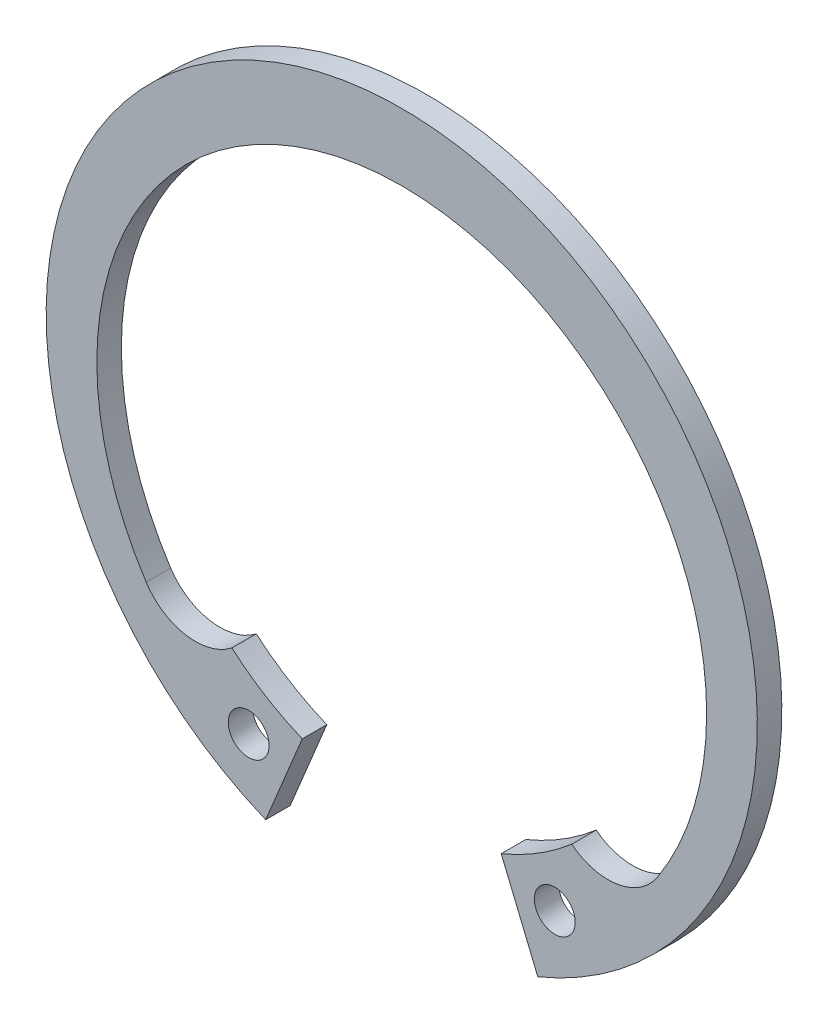
ISO-10303-21;
HEADER;
FILE_DESCRIPTION(('STEP AP214'),'2;1');
FILE_NAME('part.step','',(''),(''),'','','');
FILE_SCHEMA(('AUTOMOTIVE_DESIGN { 1 0 10303 214 1 1 1 1 }'));
ENDSEC;
DATA;
#1=APPLICATION_CONTEXT('core data for automotive mechanical design processes');
#2=APPLICATION_PROTOCOL_DEFINITION('international standard','automotive_design',2000,#1);
#3=PRODUCT_CONTEXT('',#1,'mechanical');
#4=PRODUCT('Part','Part','',(#3));
#5=PRODUCT_RELATED_PRODUCT_CATEGORY('part','',(#4));
#6=PRODUCT_DEFINITION_FORMATION('','',#4);
#7=PRODUCT_DEFINITION_CONTEXT('part definition',#1,'design');
#8=PRODUCT_DEFINITION('design','',#6,#7);
#9=PRODUCT_DEFINITION_SHAPE('','',#8);
#10=(LENGTH_UNIT() NAMED_UNIT(*) SI_UNIT(.MILLI.,.METRE.));
#11=(NAMED_UNIT(*) PLANE_ANGLE_UNIT() SI_UNIT($,.RADIAN.));
#12=(NAMED_UNIT(*) SI_UNIT($,.STERADIAN.) SOLID_ANGLE_UNIT());
#13=UNCERTAINTY_MEASURE_WITH_UNIT(LENGTH_MEASURE(1.E-05),#10,'distance_accuracy_value','');
#14=(GEOMETRIC_REPRESENTATION_CONTEXT(3) GLOBAL_UNCERTAINTY_ASSIGNED_CONTEXT((#13)) GLOBAL_UNIT_ASSIGNED_CONTEXT((#10,
#11,#12)) REPRESENTATION_CONTEXT('',''));
#15=CARTESIAN_POINT('',(0.,0.,0.));
#16=DIRECTION('',(0.,0.,1.));
#17=DIRECTION('',(1.,0.,0.));
#18=AXIS2_PLACEMENT_3D('',#15,#16,#17);
#19=CARTESIAN_POINT('',(0.,0.,-1.5));
#20=DIRECTION('',(0.,0.,1.));
#21=DIRECTION('',(1.,0.,0.));
#22=AXIS2_PLACEMENT_3D('',#19,#20,#21);
#23=CYLINDRICAL_SURFACE('',#22,21.75);
#24=CARTESIAN_POINT('',(0.,0.,0.));
#25=DIRECTION('',(0.,0.,1.));
#26=DIRECTION('',(1.,0.,0.));
#27=AXIS2_PLACEMENT_3D('',#24,#25,#26);
#28=CIRCLE('',#27,21.75);
#29=CARTESIAN_POINT('',(8.32336465394073,-20.0943798321205,0.));
#30=VERTEX_POINT('',#29);
#31=CARTESIAN_POINT('',(-8.32336465394072,-20.0943798321205,0.));
#32=VERTEX_POINT('',#31);
#33=EDGE_CURVE('E130',#30,#32,#28,.T.);
#34=ORIENTED_EDGE('',*,*,#33,.F.);
#35=DIRECTION('',(0.,0.,1.));
#36=VECTOR('',#35,1.);
#37=CARTESIAN_POINT('',(8.32336465394073,-20.0943798321205,-1.5));
#38=LINE('',#37,#36);
#39=CARTESIAN_POINT('',(8.32336465394073,-20.0943798321205,-1.5));
#40=VERTEX_POINT('',#39);
#41=EDGE_CURVE('E11',#40,#30,#38,.T.);
#42=ORIENTED_EDGE('',*,*,#41,.F.);
#43=CARTESIAN_POINT('',(0.,0.,-1.5));
#44=DIRECTION('',(0.,0.,1.));
#45=DIRECTION('',(1.,0.,0.));
#46=AXIS2_PLACEMENT_3D('',#43,#44,#45);
#47=CIRCLE('',#46,21.75);
#48=CARTESIAN_POINT('',(-8.32336465394072,-20.0943798321205,-1.5));
#49=VERTEX_POINT('',#48);
#50=EDGE_CURVE('E151',#40,#49,#47,.T.);
#51=ORIENTED_EDGE('',*,*,#50,.T.);
#52=DIRECTION('',(0.,0.,1.));
#53=VECTOR('',#52,1.);
#54=CARTESIAN_POINT('',(-8.32336465394072,-20.0943798321205,-1.5));
#55=LINE('',#54,#53);
#56=EDGE_CURVE('E36',#49,#32,#55,.T.);
#57=ORIENTED_EDGE('',*,*,#56,.T.);
#58=EDGE_LOOP('',(#34,#42,#51,#57));
#59=FACE_BOUND('',#58,.T.);
#60=ADVANCED_FACE('F33',(#59),#23,.T.);
#61=CARTESIAN_POINT('',(6.08466657460495,-14.6896845669294,-1.5));
#62=DIRECTION('',(-0.923879532511287,-0.382683432365091,0.));
#63=DIRECTION('',(0.382683432365091,-0.923879532511287,0.));
#64=AXIS2_PLACEMENT_3D('',#61,#62,#63);
#65=PLANE('',#64);
#66=DIRECTION('',(0.382683432365091,-0.923879532511286,0.));
#67=VECTOR('',#66,1.);
#68=CARTESIAN_POINT('',(6.08466657460495,-14.6896845669294,0.));
#69=LINE('',#68,#67);
#70=CARTESIAN_POINT('',(6.08466657460495,-14.6896845669294,0.));
#71=VERTEX_POINT('',#70);
#72=EDGE_CURVE('E149',#71,#30,#69,.T.);
#73=ORIENTED_EDGE('',*,*,#72,.F.);
#74=DIRECTION('',(0.,0.,1.));
#75=VECTOR('',#74,1.);
#76=CARTESIAN_POINT('',(6.08466657460495,-14.6896845669294,-1.5));
#77=LINE('',#76,#75);
#78=CARTESIAN_POINT('',(6.08466657460495,-14.6896845669294,-1.5));
#79=VERTEX_POINT('',#78);
#80=EDGE_CURVE('E42',#79,#71,#77,.T.);
#81=ORIENTED_EDGE('',*,*,#80,.F.);
#82=DIRECTION('',(0.382683432365091,-0.923879532511286,0.));
#83=VECTOR('',#82,1.);
#84=CARTESIAN_POINT('',(6.08466657460495,-14.6896845669294,-1.5));
#85=LINE('',#84,#83);
#86=EDGE_CURVE('E120',#79,#40,#85,.T.);
#87=ORIENTED_EDGE('',*,*,#86,.T.);
#88=ORIENTED_EDGE('',*,*,#41,.T.);
#89=EDGE_LOOP('',(#73,#81,#87,#88));
#90=FACE_BOUND('',#89,.T.);
#91=ADVANCED_FACE('F163',(#90),#65,.T.);
#92=CARTESIAN_POINT('',(0.,0.,-1.5));
#93=DIRECTION('',(0.,0.,1.));
#94=DIRECTION('',(1.,0.,0.));
#95=AXIS2_PLACEMENT_3D('',#92,#93,#94);
#96=CYLINDRICAL_SURFACE('',#95,15.9);
#97=CARTESIAN_POINT('',(0.,0.,0.));
#98=DIRECTION('',(0.,0.,-1.));
#99=DIRECTION('',(-1.,0.,0.));
#100=AXIS2_PLACEMENT_3D('',#97,#98,#99);
#101=CIRCLE('',#100,15.9);
#102=CARTESIAN_POINT('',(10.3953826079096,-12.0310440293089,0.));
#103=VERTEX_POINT('',#102);
#104=EDGE_CURVE('E107',#103,#71,#101,.T.);
#105=ORIENTED_EDGE('',*,*,#104,.F.);
#106=DIRECTION('',(0.,0.,1.));
#107=VECTOR('',#106,1.);
#108=CARTESIAN_POINT('',(10.3953826079096,-12.0310440293089,-1.5));
#109=LINE('',#108,#107);
#110=CARTESIAN_POINT('',(10.3953826079096,-12.0310440293089,-1.5));
#111=VERTEX_POINT('',#110);
#112=EDGE_CURVE('E102',#111,#103,#109,.T.);
#113=ORIENTED_EDGE('',*,*,#112,.F.);
#114=CARTESIAN_POINT('',(0.,0.,-1.5));
#115=DIRECTION('',(0.,0.,-1.));
#116=DIRECTION('',(-1.,0.,0.));
#117=AXIS2_PLACEMENT_3D('',#114,#115,#116);
#118=CIRCLE('',#117,15.9);
#119=EDGE_CURVE('E105',#111,#79,#118,.T.);
#120=ORIENTED_EDGE('',*,*,#119,.T.);
#121=ORIENTED_EDGE('',*,*,#80,.T.);
#122=EDGE_LOOP('',(#105,#113,#120,#121));
#123=FACE_BOUND('',#122,.T.);
#124=ADVANCED_FACE('F104',(#123),#96,.F.);
#125=CARTESIAN_POINT('',(12.619666560528,-9.20039730141722,-1.5));
#126=DIRECTION('',(0.,0.,1.));
#127=DIRECTION('',(1.,0.,0.));
#128=AXIS2_PLACEMENT_3D('',#125,#126,#127);
#129=CYLINDRICAL_SURFACE('',#128,3.6);
#130=CARTESIAN_POINT('',(12.619666560528,-9.20039730141722,0.));
#131=DIRECTION('',(0.,0.,-1.));
#132=DIRECTION('',(-1.,0.,0.));
#133=AXIS2_PLACEMENT_3D('',#130,#131,#132);
#134=CIRCLE('',#133,3.6);
#135=CARTESIAN_POINT('',(15.6383243424483,-11.1619541309921,0.));
#136=VERTEX_POINT('',#135);
#137=EDGE_CURVE('E146',#136,#103,#134,.T.);
#138=ORIENTED_EDGE('',*,*,#137,.F.);
#139=DIRECTION('',(0.,0.,1.));
#140=VECTOR('',#139,1.);
#141=CARTESIAN_POINT('',(15.6383243424483,-11.1619541309921,-1.5));
#142=LINE('',#141,#140);
#143=CARTESIAN_POINT('',(15.6383243424483,-11.1619541309921,-1.5));
#144=VERTEX_POINT('',#143);
#145=EDGE_CURVE('E112',#144,#136,#142,.T.);
#146=ORIENTED_EDGE('',*,*,#145,.F.);
#147=CARTESIAN_POINT('',(12.619666560528,-9.20039730141722,-1.5));
#148=DIRECTION('',(0.,0.,-1.));
#149=DIRECTION('',(-1.,0.,0.));
#150=AXIS2_PLACEMENT_3D('',#147,#148,#149);
#151=CIRCLE('',#150,3.6);
#152=EDGE_CURVE('E118',#144,#111,#151,.T.);
#153=ORIENTED_EDGE('',*,*,#152,.T.);
#154=ORIENTED_EDGE('',*,*,#112,.T.);
#155=EDGE_LOOP('',(#138,#146,#153,#154));
#156=FACE_BOUND('',#155,.T.);
#157=ADVANCED_FACE('F122',(#156),#129,.F.);
#158=CARTESIAN_POINT('',(0.,-1.,-1.5));
#159=DIRECTION('',(0.,0.,1.));
#160=DIRECTION('',(1.,0.,0.));
#161=AXIS2_PLACEMENT_3D('',#158,#159,#160);
#162=CYLINDRICAL_SURFACE('',#161,18.65);
#163=CARTESIAN_POINT('',(0.,-1.,0.));
#164=DIRECTION('',(0.,0.,-1.));
#165=DIRECTION('',(1.,0.,0.));
#166=AXIS2_PLACEMENT_3D('',#163,#164,#165);
#167=CIRCLE('',#166,18.65);
#168=CARTESIAN_POINT('',(-15.6383243424483,-11.1619541309921,0.));
#169=VERTEX_POINT('',#168);
#170=EDGE_CURVE('E143',#169,#136,#167,.T.);
#171=ORIENTED_EDGE('',*,*,#170,.F.);
#172=DIRECTION('',(0.,0.,1.));
#173=VECTOR('',#172,1.);
#174=CARTESIAN_POINT('',(-15.6383243424483,-11.1619541309921,-1.5));
#175=LINE('',#174,#173);
#176=CARTESIAN_POINT('',(-15.6383243424483,-11.1619541309921,-1.5));
#177=VERTEX_POINT('',#176);
#178=EDGE_CURVE('E155',#177,#169,#175,.T.);
#179=ORIENTED_EDGE('',*,*,#178,.F.);
#180=CARTESIAN_POINT('',(0.,-1.,-1.5));
#181=DIRECTION('',(0.,0.,-1.));
#182=DIRECTION('',(1.,0.,0.));
#183=AXIS2_PLACEMENT_3D('',#180,#181,#182);
#184=CIRCLE('',#183,18.65);
#185=EDGE_CURVE('E123',#177,#144,#184,.T.);
#186=ORIENTED_EDGE('',*,*,#185,.T.);
#187=ORIENTED_EDGE('',*,*,#145,.T.);
#188=EDGE_LOOP('',(#171,#179,#186,#187));
#189=FACE_BOUND('',#188,.T.);
#190=ADVANCED_FACE('F176',(#189),#162,.F.);
#191=CARTESIAN_POINT('',(-12.619666560528,-9.20039730141722,-1.5));
#192=DIRECTION('',(0.,0.,1.));
#193=DIRECTION('',(1.,0.,0.));
#194=AXIS2_PLACEMENT_3D('',#191,#192,#193);
#195=CYLINDRICAL_SURFACE('',#194,3.6);
#196=CARTESIAN_POINT('',(-12.619666560528,-9.20039730141722,0.));
#197=DIRECTION('',(0.,0.,-1.));
#198=DIRECTION('',(1.,0.,0.));
#199=AXIS2_PLACEMENT_3D('',#196,#197,#198);
#200=CIRCLE('',#199,3.6);
#201=CARTESIAN_POINT('',(-10.3953826079096,-12.0310440293089,0.));
#202=VERTEX_POINT('',#201);
#203=EDGE_CURVE('E140',#202,#169,#200,.T.);
#204=ORIENTED_EDGE('',*,*,#203,.F.);
#205=DIRECTION('',(0.,0.,1.));
#206=VECTOR('',#205,1.);
#207=CARTESIAN_POINT('',(-10.3953826079096,-12.0310440293089,-1.5));
#208=LINE('',#207,#206);
#209=CARTESIAN_POINT('',(-10.3953826079096,-12.0310440293089,-1.5));
#210=VERTEX_POINT('',#209);
#211=EDGE_CURVE('E157',#210,#202,#208,.T.);
#212=ORIENTED_EDGE('',*,*,#211,.F.);
#213=CARTESIAN_POINT('',(-12.619666560528,-9.20039730141722,-1.5));
#214=DIRECTION('',(0.,0.,-1.));
#215=DIRECTION('',(1.,0.,0.));
#216=AXIS2_PLACEMENT_3D('',#213,#214,#215);
#217=CIRCLE('',#216,3.6);
#218=EDGE_CURVE('E125',#210,#177,#217,.T.);
#219=ORIENTED_EDGE('',*,*,#218,.T.);
#220=ORIENTED_EDGE('',*,*,#178,.T.);
#221=EDGE_LOOP('',(#204,#212,#219,#220));
#222=FACE_BOUND('',#221,.T.);
#223=ADVANCED_FACE('F179',(#222),#195,.F.);
#224=CARTESIAN_POINT('',(0.,0.,-1.5));
#225=DIRECTION('',(0.,0.,1.));
#226=DIRECTION('',(1.,0.,0.));
#227=AXIS2_PLACEMENT_3D('',#224,#225,#226);
#228=CYLINDRICAL_SURFACE('',#227,15.9);
#229=CARTESIAN_POINT('',(0.,0.,0.));
#230=DIRECTION('',(0.,0.,-1.));
#231=DIRECTION('',(1.,0.,0.));
#232=AXIS2_PLACEMENT_3D('',#229,#230,#231);
#233=CIRCLE('',#232,15.9);
#234=CARTESIAN_POINT('',(-6.08466657460494,-14.6896845669295,0.));
#235=VERTEX_POINT('',#234);
#236=EDGE_CURVE('E137',#235,#202,#233,.T.);
#237=ORIENTED_EDGE('',*,*,#236,.F.);
#238=DIRECTION('',(0.,0.,1.));
#239=VECTOR('',#238,1.);
#240=CARTESIAN_POINT('',(-6.08466657460494,-14.6896845669295,-1.5));
#241=LINE('',#240,#239);
#242=CARTESIAN_POINT('',(-6.08466657460494,-14.6896845669295,-1.5));
#243=VERTEX_POINT('',#242);
#244=EDGE_CURVE('E158',#243,#235,#241,.T.);
#245=ORIENTED_EDGE('',*,*,#244,.F.);
#246=CARTESIAN_POINT('',(0.,0.,-1.5));
#247=DIRECTION('',(0.,0.,-1.));
#248=DIRECTION('',(1.,0.,0.));
#249=AXIS2_PLACEMENT_3D('',#246,#247,#248);
#250=CIRCLE('',#249,15.9);
#251=EDGE_CURVE('E225',#243,#210,#250,.T.);
#252=ORIENTED_EDGE('',*,*,#251,.T.);
#253=ORIENTED_EDGE('',*,*,#211,.T.);
#254=EDGE_LOOP('',(#237,#245,#252,#253));
#255=FACE_BOUND('',#254,.T.);
#256=ADVANCED_FACE('F183',(#255),#228,.F.);
#257=CARTESIAN_POINT('',(-6.08466657460494,-14.6896845669295,-1.5));
#258=DIRECTION('',(0.923879532511286,-0.38268343236509,0.));
#259=DIRECTION('',(0.38268343236509,0.923879532511287,0.));
#260=AXIS2_PLACEMENT_3D('',#257,#258,#259);
#261=PLANE('',#260);
#262=DIRECTION('',(0.38268343236509,0.923879532511287,0.));
#263=VECTOR('',#262,1.);
#264=CARTESIAN_POINT('',(-6.08466657460494,-14.6896845669295,0.));
#265=LINE('',#264,#263);
#266=EDGE_CURVE('E133',#32,#235,#265,.T.);
#267=ORIENTED_EDGE('',*,*,#266,.F.);
#268=ORIENTED_EDGE('',*,*,#56,.F.);
#269=DIRECTION('',(0.38268343236509,0.923879532511287,0.));
#270=VECTOR('',#269,1.);
#271=CARTESIAN_POINT('',(-6.08466657460494,-14.6896845669295,-1.5));
#272=LINE('',#271,#270);
#273=EDGE_CURVE('E223',#49,#243,#272,.T.);
#274=ORIENTED_EDGE('',*,*,#273,.T.);
#275=ORIENTED_EDGE('',*,*,#244,.T.);
#276=EDGE_LOOP('',(#267,#268,#274,#275));
#277=FACE_BOUND('',#276,.T.);
#278=ADVANCED_FACE('F160',(#277),#261,.T.);
#279=CARTESIAN_POINT('',(0.,0.,-1.5));
#280=DIRECTION('',(0.,0.,1.));
#281=DIRECTION('',(1.,0.,0.));
#282=AXIS2_PLACEMENT_3D('',#279,#280,#281);
#283=PLANE('',#282);
#284=CARTESIAN_POINT('',(9.36302270598858,-16.0715215772229,-1.5));
#285=DIRECTION('',(0.,0.,1.));
#286=DIRECTION('',(-1.,0.,0.));
#287=AXIS2_PLACEMENT_3D('',#284,#285,#286);
#288=CIRCLE('',#287,1.25);
#289=CARTESIAN_POINT('',(8.11302270598858,-16.0715215772229,-1.5));
#290=VERTEX_POINT('',#289);
#291=EDGE_CURVE('E210',#290,#290,#288,.T.);
#292=ORIENTED_EDGE('',*,*,#291,.T.);
#293=EDGE_LOOP('',(#292));
#294=FACE_BOUND('',#293,.T.);
#295=CARTESIAN_POINT('',(-9.36302270598858,-16.0715215772229,-1.5));
#296=DIRECTION('',(0.,0.,1.));
#297=DIRECTION('',(1.,0.,0.));
#298=AXIS2_PLACEMENT_3D('',#295,#296,#297);
#299=CIRCLE('',#298,1.25);
#300=CARTESIAN_POINT('',(-8.11302270598858,-16.0715215772229,-1.5));
#301=VERTEX_POINT('',#300);
#302=EDGE_CURVE('E134',#301,#301,#299,.T.);
#303=ORIENTED_EDGE('',*,*,#302,.T.);
#304=EDGE_LOOP('',(#303));
#305=FACE_BOUND('',#304,.T.);
#306=ORIENTED_EDGE('',*,*,#50,.F.);
#307=ORIENTED_EDGE('',*,*,#86,.F.);
#308=ORIENTED_EDGE('',*,*,#119,.F.);
#309=ORIENTED_EDGE('',*,*,#152,.F.);
#310=ORIENTED_EDGE('',*,*,#185,.F.);
#311=ORIENTED_EDGE('',*,*,#218,.F.);
#312=ORIENTED_EDGE('',*,*,#251,.F.);
#313=ORIENTED_EDGE('',*,*,#273,.F.);
#314=EDGE_LOOP('',(#306,#307,#308,#309,#310,#311,#312,#313));
#315=FACE_BOUND('',#314,.T.);
#316=ADVANCED_FACE('F116',(#294,#305,#315),#283,.F.);
#317=CARTESIAN_POINT('',(0.,0.,0.));
#318=DIRECTION('',(0.,0.,1.));
#319=DIRECTION('',(1.,0.,0.));
#320=AXIS2_PLACEMENT_3D('',#317,#318,#319);
#321=PLANE('',#320);
#322=CARTESIAN_POINT('',(9.36302270598858,-16.0715215772229,0.));
#323=DIRECTION('',(0.,0.,1.));
#324=DIRECTION('',(-1.,0.,0.));
#325=AXIS2_PLACEMENT_3D('',#322,#323,#324);
#326=CIRCLE('',#325,1.25);
#327=CARTESIAN_POINT('',(8.11302270598858,-16.0715215772229,0.));
#328=VERTEX_POINT('',#327);
#329=EDGE_CURVE('E213',#328,#328,#326,.T.);
#330=ORIENTED_EDGE('',*,*,#329,.F.);
#331=EDGE_LOOP('',(#330));
#332=FACE_BOUND('',#331,.T.);
#333=CARTESIAN_POINT('',(-9.36302270598858,-16.0715215772229,0.));
#334=DIRECTION('',(0.,0.,1.));
#335=DIRECTION('',(1.,0.,0.));
#336=AXIS2_PLACEMENT_3D('',#333,#334,#335);
#337=CIRCLE('',#336,1.25);
#338=CARTESIAN_POINT('',(-8.11302270598858,-16.0715215772229,0.));
#339=VERTEX_POINT('',#338);
#340=EDGE_CURVE('E215',#339,#339,#337,.T.);
#341=ORIENTED_EDGE('',*,*,#340,.F.);
#342=EDGE_LOOP('',(#341));
#343=FACE_BOUND('',#342,.T.);
#344=ORIENTED_EDGE('',*,*,#33,.T.);
#345=ORIENTED_EDGE('',*,*,#266,.T.);
#346=ORIENTED_EDGE('',*,*,#236,.T.);
#347=ORIENTED_EDGE('',*,*,#203,.T.);
#348=ORIENTED_EDGE('',*,*,#170,.T.);
#349=ORIENTED_EDGE('',*,*,#137,.T.);
#350=ORIENTED_EDGE('',*,*,#104,.T.);
#351=ORIENTED_EDGE('',*,*,#72,.T.);
#352=EDGE_LOOP('',(#344,#345,#346,#347,#348,#349,#350,#351));
#353=FACE_BOUND('',#352,.T.);
#354=ADVANCED_FACE('F162',(#332,#343,#353),#321,.T.);
#355=CARTESIAN_POINT('',(-9.36302270598858,-16.0715215772229,-1.5));
#356=DIRECTION('',(0.,0.,1.));
#357=DIRECTION('',(1.,0.,0.));
#358=AXIS2_PLACEMENT_3D('',#355,#356,#357);
#359=CYLINDRICAL_SURFACE('',#358,1.25);
#360=ORIENTED_EDGE('',*,*,#302,.F.);
#361=EDGE_LOOP('',(#360));
#362=FACE_BOUND('',#361,.T.);
#363=ORIENTED_EDGE('',*,*,#340,.T.);
#364=EDGE_LOOP('',(#363));
#365=FACE_BOUND('',#364,.T.);
#366=ADVANCED_FACE('F195',(#362,#365),#359,.F.);
#367=CARTESIAN_POINT('',(9.36302270598858,-16.0715215772229,-1.5));
#368=DIRECTION('',(0.,0.,1.));
#369=DIRECTION('',(1.,0.,0.));
#370=AXIS2_PLACEMENT_3D('',#367,#368,#369);
#371=CYLINDRICAL_SURFACE('',#370,1.25);
#372=ORIENTED_EDGE('',*,*,#291,.F.);
#373=EDGE_LOOP('',(#372));
#374=FACE_BOUND('',#373,.T.);
#375=ORIENTED_EDGE('',*,*,#329,.T.);
#376=EDGE_LOOP('',(#375));
#377=FACE_BOUND('',#376,.T.);
#378=ADVANCED_FACE('F202',(#374,#377),#371,.F.);
#379=CLOSED_SHELL('',(#60,#91,#124,#157,#190,#223,#256,#278,#316,#354,#366,#378));
#380=MANIFOLD_SOLID_BREP('B2',#379);
#381=ADVANCED_BREP_SHAPE_REPRESENTATION('',(#18,#380),#14);
#382=SHAPE_DEFINITION_REPRESENTATION(#9,#381);
ENDSEC;
END-ISO-10303-21;
